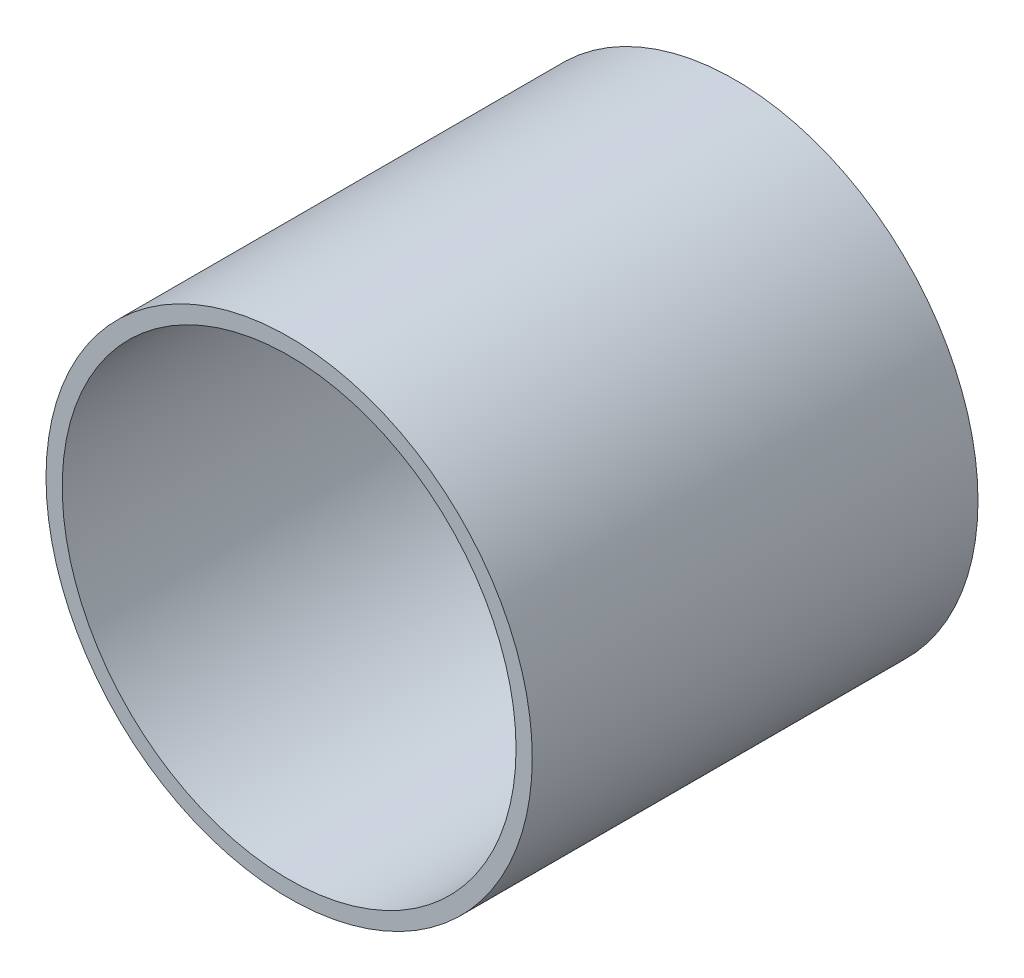
ISO-10303-21;
HEADER;
FILE_DESCRIPTION(('STEP AP214'),'2;1');
FILE_NAME('part.step','',(''),(''),'','','');
FILE_SCHEMA(('AUTOMOTIVE_DESIGN { 1 0 10303 214 1 1 1 1 }'));
ENDSEC;
DATA;
#1=APPLICATION_CONTEXT('core data for automotive mechanical design processes');
#2=APPLICATION_PROTOCOL_DEFINITION('international standard','automotive_design',2000,#1);
#3=PRODUCT_CONTEXT('',#1,'mechanical');
#4=PRODUCT('Part','Part','',(#3));
#5=PRODUCT_RELATED_PRODUCT_CATEGORY('part','',(#4));
#6=PRODUCT_DEFINITION_FORMATION('','',#4);
#7=PRODUCT_DEFINITION_CONTEXT('part definition',#1,'design');
#8=PRODUCT_DEFINITION('design','',#6,#7);
#9=PRODUCT_DEFINITION_SHAPE('','',#8);
#10=(LENGTH_UNIT() NAMED_UNIT(*) SI_UNIT(.MILLI.,.METRE.));
#11=(NAMED_UNIT(*) PLANE_ANGLE_UNIT() SI_UNIT($,.RADIAN.));
#12=(NAMED_UNIT(*) SI_UNIT($,.STERADIAN.) SOLID_ANGLE_UNIT());
#13=UNCERTAINTY_MEASURE_WITH_UNIT(LENGTH_MEASURE(1.E-05),#10,'distance_accuracy_value','');
#14=(GEOMETRIC_REPRESENTATION_CONTEXT(3) GLOBAL_UNCERTAINTY_ASSIGNED_CONTEXT((#13)) GLOBAL_UNIT_ASSIGNED_CONTEXT((#10,
#11,#12)) REPRESENTATION_CONTEXT('',''));
#15=CARTESIAN_POINT('',(0.,0.,0.));
#16=DIRECTION('',(0.,0.,1.));
#17=DIRECTION('',(1.,0.,0.));
#18=AXIS2_PLACEMENT_3D('',#15,#16,#17);
#19=CARTESIAN_POINT('',(0.,0.,3.4925));
#20=DIRECTION('',(0.,0.,-1.));
#21=DIRECTION('',(-1.,0.,0.));
#22=AXIS2_PLACEMENT_3D('',#19,#20,#21);
#23=CYLINDRICAL_SURFACE('',#22,3.80999999999998);
#24=CARTESIAN_POINT('',(0.,0.,3.4925));
#25=DIRECTION('',(0.,0.,1.));
#26=DIRECTION('',(1.,0.,0.));
#27=AXIS2_PLACEMENT_3D('',#24,#25,#26);
#28=CIRCLE('',#27,3.80999999999998);
#29=CARTESIAN_POINT('',(3.80999999999998,0.,3.4925));
#30=VERTEX_POINT('',#29);
#31=EDGE_CURVE('E10',#30,#30,#28,.T.);
#32=ORIENTED_EDGE('',*,*,#31,.F.);
#33=EDGE_LOOP('',(#32));
#34=FACE_BOUND('',#33,.T.);
#35=CARTESIAN_POINT('',(0.,0.,-3.4925));
#36=DIRECTION('',(0.,0.,1.));
#37=DIRECTION('',(1.,0.,0.));
#38=AXIS2_PLACEMENT_3D('',#35,#36,#37);
#39=CIRCLE('',#38,3.80999999999998);
#40=CARTESIAN_POINT('',(3.80999999999998,0.,-3.4925));
#41=VERTEX_POINT('',#40);
#42=EDGE_CURVE('E46',#41,#41,#39,.T.);
#43=ORIENTED_EDGE('',*,*,#42,.T.);
#44=EDGE_LOOP('',(#43));
#45=FACE_BOUND('',#44,.T.);
#46=ADVANCED_FACE('F43',(#34,#45),#23,.T.);
#47=CARTESIAN_POINT('',(0.,0.,3.4925));
#48=DIRECTION('',(0.,0.,1.));
#49=DIRECTION('',(1.,0.,0.));
#50=AXIS2_PLACEMENT_3D('',#47,#48,#49);
#51=PLANE('',#50);
#52=CARTESIAN_POINT('',(0.,0.,3.4925));
#53=DIRECTION('',(0.,0.,1.));
#54=DIRECTION('',(1.,0.,0.));
#55=AXIS2_PLACEMENT_3D('',#52,#53,#54);
#56=CIRCLE('',#55,3.556);
#57=CARTESIAN_POINT('',(3.556,0.,3.4925));
#58=VERTEX_POINT('',#57);
#59=EDGE_CURVE('E57',#58,#58,#56,.T.);
#60=ORIENTED_EDGE('',*,*,#59,.F.);
#61=EDGE_LOOP('',(#60));
#62=FACE_BOUND('',#61,.T.);
#63=ORIENTED_EDGE('',*,*,#31,.T.);
#64=EDGE_LOOP('',(#63));
#65=FACE_BOUND('',#64,.T.);
#66=ADVANCED_FACE('F74',(#62,#65),#51,.T.);
#67=CARTESIAN_POINT('',(0.,0.,-3.4925));
#68=DIRECTION('',(0.,0.,1.));
#69=DIRECTION('',(1.,0.,0.));
#70=AXIS2_PLACEMENT_3D('',#67,#68,#69);
#71=PLANE('',#70);
#72=CARTESIAN_POINT('',(0.,0.,-3.4925));
#73=DIRECTION('',(0.,0.,1.));
#74=DIRECTION('',(1.,0.,0.));
#75=AXIS2_PLACEMENT_3D('',#72,#73,#74);
#76=CIRCLE('',#75,3.556);
#77=CARTESIAN_POINT('',(3.556,0.,-3.4925));
#78=VERTEX_POINT('',#77);
#79=EDGE_CURVE('E55',#78,#78,#76,.T.);
#80=ORIENTED_EDGE('',*,*,#79,.T.);
#81=EDGE_LOOP('',(#80));
#82=FACE_BOUND('',#81,.T.);
#83=ORIENTED_EDGE('',*,*,#42,.F.);
#84=EDGE_LOOP('',(#83));
#85=FACE_BOUND('',#84,.T.);
#86=ADVANCED_FACE('F65',(#82,#85),#71,.F.);
#87=CARTESIAN_POINT('',(0.,0.,-3.4925));
#88=DIRECTION('',(0.,0.,1.));
#89=DIRECTION('',(1.,0.,0.));
#90=AXIS2_PLACEMENT_3D('',#87,#88,#89);
#91=CYLINDRICAL_SURFACE('',#90,3.556);
#92=ORIENTED_EDGE('',*,*,#79,.F.);
#93=EDGE_LOOP('',(#92));
#94=FACE_BOUND('',#93,.T.);
#95=ORIENTED_EDGE('',*,*,#59,.T.);
#96=EDGE_LOOP('',(#95));
#97=FACE_BOUND('',#96,.T.);
#98=ADVANCED_FACE('F68',(#94,#97),#91,.F.);
#99=CLOSED_SHELL('',(#46,#66,#86,#98));
#100=MANIFOLD_SOLID_BREP('B2',#99);
#101=ADVANCED_BREP_SHAPE_REPRESENTATION('',(#18,#100),#14);
#102=SHAPE_DEFINITION_REPRESENTATION(#9,#101);
ENDSEC;
END-ISO-10303-21;
